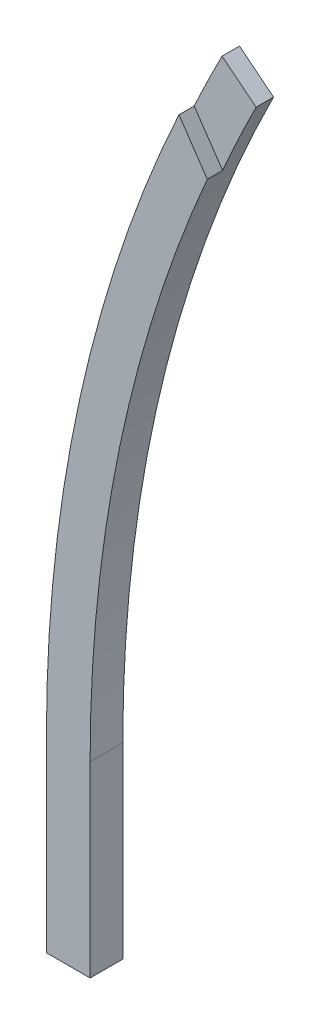
ISO-10303-21;
HEADER;
FILE_DESCRIPTION(('STEP AP214'),'2;1');
FILE_NAME('part.step','',(''),(''),'','','');
FILE_SCHEMA(('AUTOMOTIVE_DESIGN { 1 0 10303 214 1 1 1 1 }'));
ENDSEC;
DATA;
#1=APPLICATION_CONTEXT('core data for automotive mechanical design processes');
#2=APPLICATION_PROTOCOL_DEFINITION('international standard','automotive_design',2000,#1);
#3=PRODUCT_CONTEXT('',#1,'mechanical');
#4=PRODUCT('Part','Part','',(#3));
#5=PRODUCT_RELATED_PRODUCT_CATEGORY('part','',(#4));
#6=PRODUCT_DEFINITION_FORMATION('','',#4);
#7=PRODUCT_DEFINITION_CONTEXT('part definition',#1,'design');
#8=PRODUCT_DEFINITION('design','',#6,#7);
#9=PRODUCT_DEFINITION_SHAPE('','',#8);
#10=(LENGTH_UNIT() NAMED_UNIT(*) SI_UNIT(.MILLI.,.METRE.));
#11=(NAMED_UNIT(*) PLANE_ANGLE_UNIT() SI_UNIT($,.RADIAN.));
#12=(NAMED_UNIT(*) SI_UNIT($,.STERADIAN.) SOLID_ANGLE_UNIT());
#13=UNCERTAINTY_MEASURE_WITH_UNIT(LENGTH_MEASURE(1.E-05),#10,'distance_accuracy_value','');
#14=(GEOMETRIC_REPRESENTATION_CONTEXT(3) GLOBAL_UNCERTAINTY_ASSIGNED_CONTEXT((#13)) GLOBAL_UNIT_ASSIGNED_CONTEXT((#10,
#11,#12)) REPRESENTATION_CONTEXT('',''));
#15=CARTESIAN_POINT('',(0.,0.,0.));
#16=DIRECTION('',(0.,0.,1.));
#17=DIRECTION('',(1.,0.,0.));
#18=AXIS2_PLACEMENT_3D('',#15,#16,#17);
#19=CARTESIAN_POINT('',(43.9089193655786,239.372377012417,-9.525));
#20=DIRECTION('',(-0.625060038847512,-0.78057667646167,0.));
#21=DIRECTION('',(0.78057667646167,-0.625060038847512,0.));
#22=AXIS2_PLACEMENT_3D('',#19,#20,#21);
#23=PLANE('',#22);
#24=DIRECTION('',(0.780576676461661,-0.625060038847523,0.));
#25=VECTOR('',#24,1.);
#26=CARTESIAN_POINT('',(34.0033690393095,247.304414771744,-4.445));
#27=LINE('',#26,#25);
#28=CARTESIAN_POINT('',(34.0033690393095,247.304414771744,-4.445));
#29=VERTEX_POINT('',#28);
#30=CARTESIAN_POINT('',(43.9089193655786,239.372377012417,-4.445));
#31=VERTEX_POINT('',#30);
#32=EDGE_CURVE('E161',#29,#31,#27,.T.);
#33=ORIENTED_EDGE('',*,*,#32,.T.);
#34=DIRECTION('',(0.,0.,1.));
#35=VECTOR('',#34,1.);
#36=CARTESIAN_POINT('',(43.9089193655786,239.372377012417,-9.525));
#37=LINE('',#36,#35);
#38=CARTESIAN_POINT('',(43.9089193655786,239.372377012417,-9.525));
#39=VERTEX_POINT('',#38);
#40=EDGE_CURVE('E49',#39,#31,#37,.T.);
#41=ORIENTED_EDGE('',*,*,#40,.F.);
#42=DIRECTION('',(-0.78057667646167,0.625060038847512,0.));
#43=VECTOR('',#42,1.);
#44=CARTESIAN_POINT('',(43.9089193655786,239.372377012417,-9.525));
#45=LINE('',#44,#43);
#46=CARTESIAN_POINT('',(34.0033690393094,247.304414771744,-9.525));
#47=VERTEX_POINT('',#46);
#48=EDGE_CURVE('E127',#39,#47,#45,.T.);
#49=ORIENTED_EDGE('',*,*,#48,.T.);
#50=DIRECTION('',(0.,0.,1.));
#51=VECTOR('',#50,1.);
#52=CARTESIAN_POINT('',(34.0033690393094,247.304414771744,-9.525));
#53=LINE('',#52,#51);
#54=EDGE_CURVE('E120',#47,#29,#53,.T.);
#55=ORIENTED_EDGE('',*,*,#54,.T.);
#56=EDGE_LOOP('',(#33,#41,#49,#55));
#57=FACE_BOUND('',#56,.T.);
#58=ADVANCED_FACE('F41',(#57),#23,.F.);
#59=CARTESIAN_POINT('',(0.,0.,-9.525));
#60=DIRECTION('',(-1.,0.,0.));
#61=DIRECTION('',(0.,0.,-1.));
#62=AXIS2_PLACEMENT_3D('',#59,#60,#61);
#63=PLANE('',#62);
#64=DIRECTION('',(0.,1.,0.));
#65=VECTOR('',#64,1.);
#66=CARTESIAN_POINT('',(0.,0.,0.));
#67=LINE('',#66,#65);
#68=CARTESIAN_POINT('',(0.,0.,0.));
#69=VERTEX_POINT('',#68);
#70=CARTESIAN_POINT('',(0.,54.6029418000774,0.));
#71=VERTEX_POINT('',#70);
#72=EDGE_CURVE('E134',#69,#71,#67,.T.);
#73=ORIENTED_EDGE('',*,*,#72,.F.);
#74=DIRECTION('',(0.,0.,1.));
#75=VECTOR('',#74,1.);
#76=CARTESIAN_POINT('',(0.,0.,-9.525));
#77=LINE('',#76,#75);
#78=CARTESIAN_POINT('',(0.,0.,-9.525));
#79=VERTEX_POINT('',#78);
#80=EDGE_CURVE('E133',#79,#69,#77,.T.);
#81=ORIENTED_EDGE('',*,*,#80,.F.);
#82=DIRECTION('',(0.,1.,0.));
#83=VECTOR('',#82,1.);
#84=CARTESIAN_POINT('',(0.,0.,-9.525));
#85=LINE('',#84,#83);
#86=CARTESIAN_POINT('',(0.,54.6029418000774,-9.525));
#87=VERTEX_POINT('',#86);
#88=EDGE_CURVE('E144',#79,#87,#85,.T.);
#89=ORIENTED_EDGE('',*,*,#88,.T.);
#90=DIRECTION('',(0.,0.,1.));
#91=VECTOR('',#90,1.);
#92=CARTESIAN_POINT('',(0.,54.6029418000774,-9.525));
#93=LINE('',#92,#91);
#94=EDGE_CURVE('E11',#87,#71,#93,.T.);
#95=ORIENTED_EDGE('',*,*,#94,.T.);
#96=EDGE_LOOP('',(#73,#81,#89,#95));
#97=FACE_BOUND('',#96,.T.);
#98=ADVANCED_FACE('F43',(#97),#63,.F.);
#99=CARTESIAN_POINT('',(410.710829481428,54.6029418000774,-9.525));
#100=DIRECTION('',(0.,0.,1.));
#101=DIRECTION('',(-1.,0.,0.));
#102=AXIS2_PLACEMENT_3D('',#99,#100,#101);
#103=CYLINDRICAL_SURFACE('',#102,410.710829481428);
#104=CARTESIAN_POINT('',(410.710829481428,54.6029418000774,0.));
#105=DIRECTION('',(0.,0.,-1.));
#106=DIRECTION('',(1.,0.,0.));
#107=AXIS2_PLACEMENT_3D('',#104,#105,#106);
#108=CIRCLE('',#107,410.710829481428);
#109=CARTESIAN_POINT('',(34.1247397311858,218.512375512555,0.));
#110=VERTEX_POINT('',#109);
#111=EDGE_CURVE('E136',#71,#110,#108,.T.);
#112=ORIENTED_EDGE('',*,*,#111,.F.);
#113=ORIENTED_EDGE('',*,*,#94,.F.);
#114=CARTESIAN_POINT('',(410.710829481428,54.6029418000774,-9.525));
#115=DIRECTION('',(0.,0.,-1.));
#116=DIRECTION('',(1.,0.,0.));
#117=AXIS2_PLACEMENT_3D('',#114,#115,#116);
#118=CIRCLE('',#117,410.710829481428);
#119=EDGE_CURVE('E93',#87,#39,#118,.T.);
#120=ORIENTED_EDGE('',*,*,#119,.T.);
#121=ORIENTED_EDGE('',*,*,#40,.T.);
#122=CARTESIAN_POINT('',(410.710829481428,54.6029418000774,-4.445));
#123=DIRECTION('',(0.,0.,1.));
#124=DIRECTION('',(-1.,0.,0.));
#125=AXIS2_PLACEMENT_3D('',#122,#123,#124);
#126=CIRCLE('',#125,410.710829481428);
#127=CARTESIAN_POINT('',(34.1247397311858,218.512375512555,-4.445));
#128=VERTEX_POINT('',#127);
#129=EDGE_CURVE('E156',#31,#128,#126,.T.);
#130=ORIENTED_EDGE('',*,*,#129,.T.);
#131=DIRECTION('',(0.,0.,1.));
#132=VECTOR('',#131,1.);
#133=CARTESIAN_POINT('',(34.1247397311858,218.512375512555,-4.445));
#134=LINE('',#133,#132);
#135=EDGE_CURVE('E172',#128,#110,#134,.T.);
#136=ORIENTED_EDGE('',*,*,#135,.T.);
#137=EDGE_LOOP('',(#112,#113,#120,#121,#130,#136));
#138=FACE_BOUND('',#137,.T.);
#139=ADVANCED_FACE('F153',(#138),#103,.F.);
#140=CARTESIAN_POINT('',(406.952423051707,54.8557795172159,-9.525));
#141=DIRECTION('',(0.,0.,1.));
#142=DIRECTION('',(-1.,0.,0.));
#143=AXIS2_PLACEMENT_3D('',#140,#141,#142);
#144=CYLINDRICAL_SURFACE('',#143,419.675439000274);
#145=CARTESIAN_POINT('',(406.952423051707,54.8557795172159,-4.445));
#146=DIRECTION('',(0.,0.,-1.));
#147=DIRECTION('',(-1.,0.,0.));
#148=AXIS2_PLACEMENT_3D('',#145,#146,#147);
#149=CIRCLE('',#148,419.675439000274);
#150=CARTESIAN_POINT('',(25.8755558609307,230.662194053592,-4.445));
#151=VERTEX_POINT('',#150);
#152=EDGE_CURVE('E164',#151,#29,#149,.T.);
#153=ORIENTED_EDGE('',*,*,#152,.T.);
#154=ORIENTED_EDGE('',*,*,#54,.F.);
#155=CARTESIAN_POINT('',(406.952423051707,54.8557795172159,-9.525));
#156=DIRECTION('',(0.,0.,1.));
#157=DIRECTION('',(1.,0.,0.));
#158=AXIS2_PLACEMENT_3D('',#155,#156,#157);
#159=CIRCLE('',#158,419.675439000274);
#160=CARTESIAN_POINT('',(-12.7229397862386,54.6029418000774,-9.525));
#161=VERTEX_POINT('',#160);
#162=EDGE_CURVE('E108',#47,#161,#159,.T.);
#163=ORIENTED_EDGE('',*,*,#162,.T.);
#164=DIRECTION('',(0.,0.,1.));
#165=VECTOR('',#164,1.);
#166=CARTESIAN_POINT('',(-12.7229397862386,54.6029418000774,-9.525));
#167=LINE('',#166,#165);
#168=CARTESIAN_POINT('',(-12.7229397862386,54.6029418000774,0.));
#169=VERTEX_POINT('',#168);
#170=EDGE_CURVE('E114',#161,#169,#167,.T.);
#171=ORIENTED_EDGE('',*,*,#170,.T.);
#172=CARTESIAN_POINT('',(406.952423051707,54.8557795172159,0.));
#173=DIRECTION('',(0.,0.,1.));
#174=DIRECTION('',(1.,0.,0.));
#175=AXIS2_PLACEMENT_3D('',#172,#173,#174);
#176=CIRCLE('',#175,419.675439000274);
#177=CARTESIAN_POINT('',(25.8755558609307,230.662194053592,0.));
#178=VERTEX_POINT('',#177);
#179=EDGE_CURVE('E140',#178,#169,#176,.T.);
#180=ORIENTED_EDGE('',*,*,#179,.F.);
#181=DIRECTION('',(0.,0.,1.));
#182=VECTOR('',#181,1.);
#183=CARTESIAN_POINT('',(25.8755558609307,230.662194053592,-4.445));
#184=LINE('',#183,#182);
#185=EDGE_CURVE('E137',#151,#178,#184,.T.);
#186=ORIENTED_EDGE('',*,*,#185,.F.);
#187=EDGE_LOOP('',(#153,#154,#163,#171,#180,#186));
#188=FACE_BOUND('',#187,.T.);
#189=ADVANCED_FACE('F124',(#188),#144,.T.);
#190=CARTESIAN_POINT('',(-12.6900390792102,-0.0076452439082674,-9.525));
#191=DIRECTION('',(0.999999818520883,0.00060246012428169,0.));
#192=DIRECTION('',(-0.000602460124281691,0.999999818520883,0.));
#193=AXIS2_PLACEMENT_3D('',#190,#191,#192);
#194=PLANE('',#193);
#195=DIRECTION('',(0.000602460124281691,-0.999999818520883,0.));
#196=VECTOR('',#195,1.);
#197=CARTESIAN_POINT('',(-12.6900390792102,-0.0076452439082674,0.));
#198=LINE('',#197,#196);
#199=CARTESIAN_POINT('',(-12.6900390792102,-0.0076452439082674,0.));
#200=VERTEX_POINT('',#199);
#201=EDGE_CURVE('E116',#169,#200,#198,.T.);
#202=ORIENTED_EDGE('',*,*,#201,.F.);
#203=ORIENTED_EDGE('',*,*,#170,.F.);
#204=DIRECTION('',(0.000602460124281691,-0.999999818520883,0.));
#205=VECTOR('',#204,1.);
#206=CARTESIAN_POINT('',(-12.6900390792102,-0.0076452439082674,-9.525));
#207=LINE('',#206,#205);
#208=CARTESIAN_POINT('',(-12.6900390792102,-0.0076452439082674,-9.525));
#209=VERTEX_POINT('',#208);
#210=EDGE_CURVE('E104',#161,#209,#207,.T.);
#211=ORIENTED_EDGE('',*,*,#210,.T.);
#212=DIRECTION('',(0.,0.,1.));
#213=VECTOR('',#212,1.);
#214=CARTESIAN_POINT('',(-12.6900390792102,-0.0076452439082674,-9.525));
#215=LINE('',#214,#213);
#216=EDGE_CURVE('E121',#209,#200,#215,.T.);
#217=ORIENTED_EDGE('',*,*,#216,.T.);
#218=EDGE_LOOP('',(#202,#203,#211,#217));
#219=FACE_BOUND('',#218,.T.);
#220=ADVANCED_FACE('F115',(#219),#194,.F.);
#221=CARTESIAN_POINT('',(0.,0.,-9.525));
#222=DIRECTION('',(-0.000602460124282856,0.999999818520883,0.));
#223=DIRECTION('',(-0.999999818520883,-0.000602460124282856,0.));
#224=AXIS2_PLACEMENT_3D('',#221,#222,#223);
#225=PLANE('',#224);
#226=DIRECTION('',(0.999999818520883,0.000602460124282856,0.));
#227=VECTOR('',#226,1.);
#228=CARTESIAN_POINT('',(0.,0.,0.));
#229=LINE('',#228,#227);
#230=EDGE_CURVE('E86',#200,#69,#229,.T.);
#231=ORIENTED_EDGE('',*,*,#230,.F.);
#232=ORIENTED_EDGE('',*,*,#216,.F.);
#233=DIRECTION('',(0.999999818520883,0.000602460124282856,0.));
#234=VECTOR('',#233,1.);
#235=CARTESIAN_POINT('',(0.,0.,-9.525));
#236=LINE('',#235,#234);
#237=EDGE_CURVE('E65',#209,#79,#236,.T.);
#238=ORIENTED_EDGE('',*,*,#237,.T.);
#239=ORIENTED_EDGE('',*,*,#80,.T.);
#240=EDGE_LOOP('',(#231,#232,#238,#239));
#241=FACE_BOUND('',#240,.T.);
#242=ADVANCED_FACE('F180',(#241),#225,.F.);
#243=CARTESIAN_POINT('',(410.710829481428,54.6029418000774,-9.525));
#244=DIRECTION('',(0.,0.,-1.));
#245=DIRECTION('',(1.,0.,0.));
#246=AXIS2_PLACEMENT_3D('',#243,#244,#245);
#247=PLANE('',#246);
#248=ORIENTED_EDGE('',*,*,#88,.F.);
#249=ORIENTED_EDGE('',*,*,#237,.F.);
#250=ORIENTED_EDGE('',*,*,#210,.F.);
#251=ORIENTED_EDGE('',*,*,#162,.F.);
#252=ORIENTED_EDGE('',*,*,#48,.F.);
#253=ORIENTED_EDGE('',*,*,#119,.F.);
#254=EDGE_LOOP('',(#248,#249,#250,#251,#252,#253));
#255=FACE_BOUND('',#254,.T.);
#256=ADVANCED_FACE('F106',(#255),#247,.T.);
#257=CARTESIAN_POINT('',(410.710829481428,54.6029418000774,0.));
#258=DIRECTION('',(0.,0.,-1.));
#259=DIRECTION('',(1.,0.,0.));
#260=AXIS2_PLACEMENT_3D('',#257,#258,#259);
#261=PLANE('',#260);
#262=ORIENTED_EDGE('',*,*,#179,.T.);
#263=ORIENTED_EDGE('',*,*,#201,.T.);
#264=ORIENTED_EDGE('',*,*,#230,.T.);
#265=ORIENTED_EDGE('',*,*,#72,.T.);
#266=ORIENTED_EDGE('',*,*,#111,.T.);
#267=DIRECTION('',(-0.561718864631112,0.827328179815927,0.));
#268=VECTOR('',#267,1.);
#269=CARTESIAN_POINT('',(25.8755558609307,230.662194053592,0.));
#270=LINE('',#269,#268);
#271=EDGE_CURVE('E56',#110,#178,#270,.T.);
#272=ORIENTED_EDGE('',*,*,#271,.T.);
#273=EDGE_LOOP('',(#262,#263,#264,#265,#266,#272));
#274=FACE_BOUND('',#273,.T.);
#275=ADVANCED_FACE('F181',(#274),#261,.F.);
#276=CARTESIAN_POINT('',(25.8755558609307,230.662194053592,-4.445));
#277=DIRECTION('',(-0.827328179815927,-0.561718864631112,0.));
#278=DIRECTION('',(0.561718864631112,-0.827328179815927,0.));
#279=AXIS2_PLACEMENT_3D('',#276,#277,#278);
#280=PLANE('',#279);
#281=ORIENTED_EDGE('',*,*,#271,.F.);
#282=ORIENTED_EDGE('',*,*,#135,.F.);
#283=DIRECTION('',(-0.561718864631112,0.827328179815927,0.));
#284=VECTOR('',#283,1.);
#285=CARTESIAN_POINT('',(25.8755558609307,230.662194053592,-4.445));
#286=LINE('',#285,#284);
#287=EDGE_CURVE('E166',#128,#151,#286,.T.);
#288=ORIENTED_EDGE('',*,*,#287,.T.);
#289=ORIENTED_EDGE('',*,*,#185,.T.);
#290=EDGE_LOOP('',(#281,#282,#288,#289));
#291=FACE_BOUND('',#290,.T.);
#292=ADVANCED_FACE('F186',(#291),#280,.F.);
#293=CARTESIAN_POINT('',(406.952423051707,54.8557795172159,-4.445));
#294=DIRECTION('',(0.,0.,1.));
#295=DIRECTION('',(-1.,0.,0.));
#296=AXIS2_PLACEMENT_3D('',#293,#294,#295);
#297=PLANE('',#296);
#298=ORIENTED_EDGE('',*,*,#152,.F.);
#299=ORIENTED_EDGE('',*,*,#287,.F.);
#300=ORIENTED_EDGE('',*,*,#129,.F.);
#301=ORIENTED_EDGE('',*,*,#32,.F.);
#302=EDGE_LOOP('',(#298,#299,#300,#301));
#303=FACE_BOUND('',#302,.T.);
#304=ADVANCED_FACE('F187',(#303),#297,.T.);
#305=CLOSED_SHELL('',(#58,#98,#139,#189,#220,#242,#256,#275,#292,#304));
#306=MANIFOLD_SOLID_BREP('B2',#305);
#307=ADVANCED_BREP_SHAPE_REPRESENTATION('',(#18,#306),#14);
#308=SHAPE_DEFINITION_REPRESENTATION(#9,#307);
ENDSEC;
END-ISO-10303-21;
